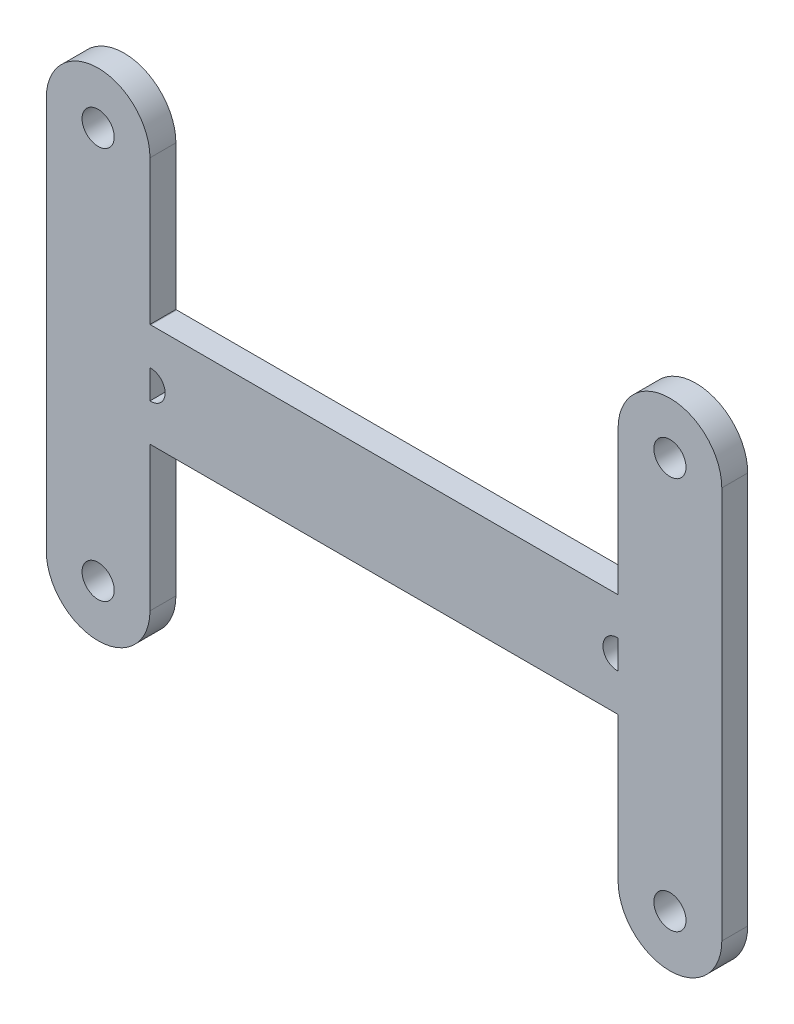
ISO-10303-21;
HEADER;
FILE_DESCRIPTION(('STEP AP214'),'2;1');
FILE_NAME('part.step','',(''),(''),'','','');
FILE_SCHEMA(('AUTOMOTIVE_DESIGN { 1 0 10303 214 1 1 1 1 }'));
ENDSEC;
DATA;
#1=APPLICATION_CONTEXT('core data for automotive mechanical design processes');
#2=APPLICATION_PROTOCOL_DEFINITION('international standard','automotive_design',2000,#1);
#3=PRODUCT_CONTEXT('',#1,'mechanical');
#4=PRODUCT('Part','Part','',(#3));
#5=PRODUCT_RELATED_PRODUCT_CATEGORY('part','',(#4));
#6=PRODUCT_DEFINITION_FORMATION('','',#4);
#7=PRODUCT_DEFINITION_CONTEXT('part definition',#1,'design');
#8=PRODUCT_DEFINITION('design','',#6,#7);
#9=PRODUCT_DEFINITION_SHAPE('','',#8);
#10=(LENGTH_UNIT() NAMED_UNIT(*) SI_UNIT(.MILLI.,.METRE.));
#11=(NAMED_UNIT(*) PLANE_ANGLE_UNIT() SI_UNIT($,.RADIAN.));
#12=(NAMED_UNIT(*) SI_UNIT($,.STERADIAN.) SOLID_ANGLE_UNIT());
#13=UNCERTAINTY_MEASURE_WITH_UNIT(LENGTH_MEASURE(1.E-05),#10,'distance_accuracy_value','');
#14=(GEOMETRIC_REPRESENTATION_CONTEXT(3) GLOBAL_UNCERTAINTY_ASSIGNED_CONTEXT((#13)) GLOBAL_UNIT_ASSIGNED_CONTEXT((#10,
#11,#12)) REPRESENTATION_CONTEXT('',''));
#15=CARTESIAN_POINT('',(0.,0.,0.));
#16=DIRECTION('',(0.,0.,1.));
#17=DIRECTION('',(1.,0.,0.));
#18=AXIS2_PLACEMENT_3D('',#15,#16,#17);
#19=CARTESIAN_POINT('',(-22.5771644662754,0.,2.5));
#20=DIRECTION('',(1.,0.,0.));
#21=DIRECTION('',(0.,0.,-1.));
#22=AXIS2_PLACEMENT_3D('',#19,#20,#21);
#23=PLANE('',#22);
#24=DIRECTION('',(0.,-1.,0.));
#25=VECTOR('',#24,1.);
#26=CARTESIAN_POINT('',(-22.5771644662754,0.,0.));
#27=LINE('',#26,#25);
#28=CARTESIAN_POINT('',(-22.5771644662754,1.38277254756162,0.));
#29=VERTEX_POINT('',#28);
#30=CARTESIAN_POINT('',(-22.5771644662754,-1.38277254756162,0.));
#31=VERTEX_POINT('',#30);
#32=EDGE_CURVE('E264',#29,#31,#27,.T.);
#33=ORIENTED_EDGE('',*,*,#32,.F.);
#34=DIRECTION('',(0.,0.,-1.));
#35=VECTOR('',#34,1.);
#36=CARTESIAN_POINT('',(-22.5771644662754,1.38277254756162,2.5));
#37=LINE('',#36,#35);
#38=CARTESIAN_POINT('',(-22.5771644662754,1.38277254756162,2.5));
#39=VERTEX_POINT('',#38);
#40=EDGE_CURVE('E11',#39,#29,#37,.T.);
#41=ORIENTED_EDGE('',*,*,#40,.F.);
#42=DIRECTION('',(0.,-1.,0.));
#43=VECTOR('',#42,1.);
#44=CARTESIAN_POINT('',(-22.5771644662754,0.,2.5));
#45=LINE('',#44,#43);
#46=CARTESIAN_POINT('',(-22.5771644662754,-1.38277254756162,2.5));
#47=VERTEX_POINT('',#46);
#48=EDGE_CURVE('E190',#39,#47,#45,.T.);
#49=ORIENTED_EDGE('',*,*,#48,.T.);
#50=DIRECTION('',(0.,0.,-1.));
#51=VECTOR('',#50,1.);
#52=CARTESIAN_POINT('',(-22.5771644662754,-1.38277254756162,2.5));
#53=LINE('',#52,#51);
#54=EDGE_CURVE('E51',#47,#31,#53,.T.);
#55=ORIENTED_EDGE('',*,*,#54,.T.);
#56=EDGE_LOOP('',(#33,#41,#49,#55));
#57=FACE_BOUND('',#56,.T.);
#58=ADVANCED_FACE('F41',(#57),#23,.T.);
#59=CARTESIAN_POINT('',(22.5,0.,2.5));
#60=DIRECTION('',(0.,0.,-1.));
#61=DIRECTION('',(-1.,0.,0.));
#62=AXIS2_PLACEMENT_3D('',#59,#60,#61);
#63=CYLINDRICAL_SURFACE('',#62,1.38492392323391);
#64=CARTESIAN_POINT('',(22.5,0.,0.));
#65=DIRECTION('',(0.,0.,1.));
#66=DIRECTION('',(1.,0.,0.));
#67=AXIS2_PLACEMENT_3D('',#64,#65,#66);
#68=CIRCLE('',#67,1.38492392323391);
#69=CARTESIAN_POINT('',(22.5771644662754,-1.38277254756162,0.));
#70=VERTEX_POINT('',#69);
#71=CARTESIAN_POINT('',(22.5771644662754,1.38277254756162,0.));
#72=VERTEX_POINT('',#71);
#73=EDGE_CURVE('E261',#70,#72,#68,.F.);
#74=ORIENTED_EDGE('',*,*,#73,.T.);
#75=DIRECTION('',(0.,0.,-1.));
#76=VECTOR('',#75,1.);
#77=CARTESIAN_POINT('',(22.5771644662754,1.38277254756162,2.5));
#78=LINE('',#77,#76);
#79=CARTESIAN_POINT('',(22.5771644662754,1.38277254756162,2.5));
#80=VERTEX_POINT('',#79);
#81=EDGE_CURVE('E199',#80,#72,#78,.T.);
#82=ORIENTED_EDGE('',*,*,#81,.F.);
#83=CARTESIAN_POINT('',(22.5,0.,2.5));
#84=DIRECTION('',(0.,0.,1.));
#85=DIRECTION('',(1.,0.,0.));
#86=AXIS2_PLACEMENT_3D('',#83,#84,#85);
#87=CIRCLE('',#86,1.38492392323391);
#88=CARTESIAN_POINT('',(22.5771644662754,-1.38277254756162,2.5));
#89=VERTEX_POINT('',#88);
#90=EDGE_CURVE('E186',#89,#80,#87,.F.);
#91=ORIENTED_EDGE('',*,*,#90,.F.);
#92=DIRECTION('',(0.,0.,-1.));
#93=VECTOR('',#92,1.);
#94=CARTESIAN_POINT('',(22.5771644662754,-1.38277254756162,2.5));
#95=LINE('',#94,#93);
#96=EDGE_CURVE('E193',#89,#70,#95,.T.);
#97=ORIENTED_EDGE('',*,*,#96,.T.);
#98=EDGE_LOOP('',(#74,#82,#91,#97));
#99=FACE_BOUND('',#98,.T.);
#100=ADVANCED_FACE('F201',(#99),#63,.F.);
#101=CARTESIAN_POINT('',(27.5771644662754,18.9226855296852,2.5));
#102=DIRECTION('',(0.,0.,-1.));
#103=DIRECTION('',(-1.,0.,0.));
#104=AXIS2_PLACEMENT_3D('',#101,#102,#103);
#105=CYLINDRICAL_SURFACE('',#104,5.);
#106=CARTESIAN_POINT('',(27.5771644662754,18.9226855296852,0.));
#107=DIRECTION('',(0.,0.,1.));
#108=DIRECTION('',(1.,0.,0.));
#109=AXIS2_PLACEMENT_3D('',#106,#107,#108);
#110=CIRCLE('',#109,5.);
#111=CARTESIAN_POINT('',(22.5771644662754,18.9226855296852,0.));
#112=VERTEX_POINT('',#111);
#113=CARTESIAN_POINT('',(32.5771644662754,18.9226855296852,0.));
#114=VERTEX_POINT('',#113);
#115=EDGE_CURVE('E225',#112,#114,#110,.F.);
#116=ORIENTED_EDGE('',*,*,#115,.F.);
#117=DIRECTION('',(0.,0.,-1.));
#118=VECTOR('',#117,1.);
#119=CARTESIAN_POINT('',(22.5771644662754,18.9226855296852,2.5));
#120=LINE('',#119,#118);
#121=CARTESIAN_POINT('',(22.5771644662754,18.9226855296852,2.5));
#122=VERTEX_POINT('',#121);
#123=EDGE_CURVE('E45',#122,#112,#120,.T.);
#124=ORIENTED_EDGE('',*,*,#123,.F.);
#125=CARTESIAN_POINT('',(27.5771644662754,18.9226855296852,2.5));
#126=DIRECTION('',(0.,0.,1.));
#127=DIRECTION('',(1.,0.,0.));
#128=AXIS2_PLACEMENT_3D('',#125,#126,#127);
#129=CIRCLE('',#128,5.);
#130=CARTESIAN_POINT('',(32.5771644662754,18.9226855296852,2.5));
#131=VERTEX_POINT('',#130);
#132=EDGE_CURVE('E281',#122,#131,#129,.F.);
#133=ORIENTED_EDGE('',*,*,#132,.T.);
#134=DIRECTION('',(0.,0.,-1.));
#135=VECTOR('',#134,1.);
#136=CARTESIAN_POINT('',(32.5771644662754,18.9226855296852,2.5));
#137=LINE('',#136,#135);
#138=EDGE_CURVE('E224',#131,#114,#137,.T.);
#139=ORIENTED_EDGE('',*,*,#138,.T.);
#140=EDGE_LOOP('',(#116,#124,#133,#139));
#141=FACE_BOUND('',#140,.T.);
#142=ADVANCED_FACE('F43',(#141),#105,.T.);
#143=CARTESIAN_POINT('',(22.5771644662754,0.,2.5));
#144=DIRECTION('',(1.,0.,0.));
#145=DIRECTION('',(0.,0.,-1.));
#146=AXIS2_PLACEMENT_3D('',#143,#144,#145);
#147=PLANE('',#146);
#148=DIRECTION('',(0.,-1.,0.));
#149=VECTOR('',#148,1.);
#150=CARTESIAN_POINT('',(22.5771644662754,0.,0.));
#151=LINE('',#150,#149);
#152=CARTESIAN_POINT('',(22.5771644662754,4.99940452905588,0.));
#153=VERTEX_POINT('',#152);
#154=EDGE_CURVE('E228',#112,#153,#151,.T.);
#155=ORIENTED_EDGE('',*,*,#154,.T.);
#156=DIRECTION('',(0.,0.,-1.));
#157=VECTOR('',#156,1.);
#158=CARTESIAN_POINT('',(22.5771644662754,4.99940452905588,2.5));
#159=LINE('',#158,#157);
#160=CARTESIAN_POINT('',(22.5771644662754,4.99940452905588,2.5));
#161=VERTEX_POINT('',#160);
#162=EDGE_CURVE('E315',#161,#153,#159,.T.);
#163=ORIENTED_EDGE('',*,*,#162,.F.);
#164=DIRECTION('',(0.,-1.,0.));
#165=VECTOR('',#164,1.);
#166=CARTESIAN_POINT('',(22.5771644662754,0.,2.5));
#167=LINE('',#166,#165);
#168=EDGE_CURVE('E324',#122,#161,#167,.T.);
#169=ORIENTED_EDGE('',*,*,#168,.F.);
#170=ORIENTED_EDGE('',*,*,#123,.T.);
#171=EDGE_LOOP('',(#155,#163,#169,#170));
#172=FACE_BOUND('',#171,.T.);
#173=ADVANCED_FACE('F323',(#172),#147,.F.);
#174=CARTESIAN_POINT('',(22.5,0.,2.5));
#175=DIRECTION('',(0.,0.,-1.));
#176=DIRECTION('',(-1.,0.,0.));
#177=AXIS2_PLACEMENT_3D('',#174,#175,#176);
#178=CYLINDRICAL_SURFACE('',#177,5.);
#179=CARTESIAN_POINT('',(22.5,0.,0.));
#180=DIRECTION('',(0.,0.,1.));
#181=DIRECTION('',(1.,0.,0.));
#182=AXIS2_PLACEMENT_3D('',#179,#180,#181);
#183=CIRCLE('',#182,5.);
#184=CARTESIAN_POINT('',(22.5,5.,0.));
#185=VERTEX_POINT('',#184);
#186=EDGE_CURVE('E230',#153,#185,#183,.T.);
#187=ORIENTED_EDGE('',*,*,#186,.T.);
#188=DIRECTION('',(0.,0.,-1.));
#189=VECTOR('',#188,1.);
#190=CARTESIAN_POINT('',(22.5,5.,2.5));
#191=LINE('',#190,#189);
#192=CARTESIAN_POINT('',(22.5,5.,2.5));
#193=VERTEX_POINT('',#192);
#194=EDGE_CURVE('E314',#193,#185,#191,.T.);
#195=ORIENTED_EDGE('',*,*,#194,.F.);
#196=CARTESIAN_POINT('',(22.5,0.,2.5));
#197=DIRECTION('',(0.,0.,1.));
#198=DIRECTION('',(1.,0.,0.));
#199=AXIS2_PLACEMENT_3D('',#196,#197,#198);
#200=CIRCLE('',#199,5.);
#201=EDGE_CURVE('E711',#161,#193,#200,.T.);
#202=ORIENTED_EDGE('',*,*,#201,.F.);
#203=ORIENTED_EDGE('',*,*,#162,.T.);
#204=EDGE_LOOP('',(#187,#195,#202,#203));
#205=FACE_BOUND('',#204,.T.);
#206=ADVANCED_FACE('F402',(#205),#178,.T.);
#207=CARTESIAN_POINT('',(0.,5.,2.5));
#208=DIRECTION('',(0.,1.,0.));
#209=DIRECTION('',(0.,0.,1.));
#210=AXIS2_PLACEMENT_3D('',#207,#208,#209);
#211=PLANE('',#210);
#212=DIRECTION('',(1.,0.,0.));
#213=VECTOR('',#212,1.);
#214=CARTESIAN_POINT('',(0.,5.,0.));
#215=LINE('',#214,#213);
#216=CARTESIAN_POINT('',(-22.5,5.,0.));
#217=VERTEX_POINT('',#216);
#218=EDGE_CURVE('E234',#217,#185,#215,.T.);
#219=ORIENTED_EDGE('',*,*,#218,.F.);
#220=DIRECTION('',(0.,0.,-1.));
#221=VECTOR('',#220,1.);
#222=CARTESIAN_POINT('',(-22.5,5.,2.5));
#223=LINE('',#222,#221);
#224=CARTESIAN_POINT('',(-22.5,5.,2.5));
#225=VERTEX_POINT('',#224);
#226=EDGE_CURVE('E312',#225,#217,#223,.T.);
#227=ORIENTED_EDGE('',*,*,#226,.F.);
#228=DIRECTION('',(1.,0.,0.));
#229=VECTOR('',#228,1.);
#230=CARTESIAN_POINT('',(0.,5.,2.5));
#231=LINE('',#230,#229);
#232=EDGE_CURVE('E401',#225,#193,#231,.T.);
#233=ORIENTED_EDGE('',*,*,#232,.T.);
#234=ORIENTED_EDGE('',*,*,#194,.T.);
#235=EDGE_LOOP('',(#219,#227,#233,#234));
#236=FACE_BOUND('',#235,.T.);
#237=ADVANCED_FACE('F397',(#236),#211,.T.);
#238=CARTESIAN_POINT('',(-22.5,0.,2.5));
#239=DIRECTION('',(0.,0.,-1.));
#240=DIRECTION('',(-1.,0.,0.));
#241=AXIS2_PLACEMENT_3D('',#238,#239,#240);
#242=CYLINDRICAL_SURFACE('',#241,5.);
#243=CARTESIAN_POINT('',(-22.5,0.,0.));
#244=DIRECTION('',(0.,0.,1.));
#245=DIRECTION('',(1.,0.,0.));
#246=AXIS2_PLACEMENT_3D('',#243,#244,#245);
#247=CIRCLE('',#246,5.);
#248=CARTESIAN_POINT('',(-22.5771644662754,4.99940452905588,0.));
#249=VERTEX_POINT('',#248);
#250=EDGE_CURVE('E238',#217,#249,#247,.T.);
#251=ORIENTED_EDGE('',*,*,#250,.T.);
#252=DIRECTION('',(0.,0.,-1.));
#253=VECTOR('',#252,1.);
#254=CARTESIAN_POINT('',(-22.5771644662754,4.99940452905588,2.5));
#255=LINE('',#254,#253);
#256=CARTESIAN_POINT('',(-22.5771644662754,4.99940452905588,2.5));
#257=VERTEX_POINT('',#256);
#258=EDGE_CURVE('E310',#257,#249,#255,.T.);
#259=ORIENTED_EDGE('',*,*,#258,.F.);
#260=CARTESIAN_POINT('',(-22.5,0.,2.5));
#261=DIRECTION('',(0.,0.,1.));
#262=DIRECTION('',(1.,0.,0.));
#263=AXIS2_PLACEMENT_3D('',#260,#261,#262);
#264=CIRCLE('',#263,5.);
#265=EDGE_CURVE('E718',#225,#257,#264,.T.);
#266=ORIENTED_EDGE('',*,*,#265,.F.);
#267=ORIENTED_EDGE('',*,*,#226,.T.);
#268=EDGE_LOOP('',(#251,#259,#266,#267));
#269=FACE_BOUND('',#268,.T.);
#270=ADVANCED_FACE('F394',(#269),#242,.T.);
#271=CARTESIAN_POINT('',(-22.5771644662754,0.,2.5));
#272=DIRECTION('',(1.,0.,0.));
#273=DIRECTION('',(0.,0.,-1.));
#274=AXIS2_PLACEMENT_3D('',#271,#272,#273);
#275=PLANE('',#274);
#276=DIRECTION('',(0.,-1.,0.));
#277=VECTOR('',#276,1.);
#278=CARTESIAN_POINT('',(-22.5771644662754,0.,0.));
#279=LINE('',#278,#277);
#280=CARTESIAN_POINT('',(-22.5771644662754,18.9226855296852,0.));
#281=VERTEX_POINT('',#280);
#282=EDGE_CURVE('E241',#281,#249,#279,.T.);
#283=ORIENTED_EDGE('',*,*,#282,.F.);
#284=DIRECTION('',(0.,0.,-1.));
#285=VECTOR('',#284,1.);
#286=CARTESIAN_POINT('',(-22.5771644662754,18.9226855296852,2.5));
#287=LINE('',#286,#285);
#288=CARTESIAN_POINT('',(-22.5771644662754,18.9226855296852,2.5));
#289=VERTEX_POINT('',#288);
#290=EDGE_CURVE('E308',#289,#281,#287,.T.);
#291=ORIENTED_EDGE('',*,*,#290,.F.);
#292=DIRECTION('',(0.,-1.,0.));
#293=VECTOR('',#292,1.);
#294=CARTESIAN_POINT('',(-22.5771644662754,0.,2.5));
#295=LINE('',#294,#293);
#296=EDGE_CURVE('E391',#289,#257,#295,.T.);
#297=ORIENTED_EDGE('',*,*,#296,.T.);
#298=ORIENTED_EDGE('',*,*,#258,.T.);
#299=EDGE_LOOP('',(#283,#291,#297,#298));
#300=FACE_BOUND('',#299,.T.);
#301=ADVANCED_FACE('F386',(#300),#275,.T.);
#302=CARTESIAN_POINT('',(-27.5771644662754,18.9226855296852,2.5));
#303=DIRECTION('',(0.,0.,-1.));
#304=DIRECTION('',(-1.,0.,0.));
#305=AXIS2_PLACEMENT_3D('',#302,#303,#304);
#306=CYLINDRICAL_SURFACE('',#305,5.);
#307=CARTESIAN_POINT('',(-27.5771644662754,18.9226855296852,0.));
#308=DIRECTION('',(0.,0.,1.));
#309=DIRECTION('',(1.,0.,0.));
#310=AXIS2_PLACEMENT_3D('',#307,#308,#309);
#311=CIRCLE('',#310,5.);
#312=CARTESIAN_POINT('',(-32.5771644662754,18.9226855296852,0.));
#313=VERTEX_POINT('',#312);
#314=EDGE_CURVE('E245',#281,#313,#311,.T.);
#315=ORIENTED_EDGE('',*,*,#314,.T.);
#316=DIRECTION('',(0.,0.,-1.));
#317=VECTOR('',#316,1.);
#318=CARTESIAN_POINT('',(-32.5771644662754,18.9226855296852,2.5));
#319=LINE('',#318,#317);
#320=CARTESIAN_POINT('',(-32.5771644662754,18.9226855296852,2.5));
#321=VERTEX_POINT('',#320);
#322=EDGE_CURVE('E305',#321,#313,#319,.T.);
#323=ORIENTED_EDGE('',*,*,#322,.F.);
#324=CARTESIAN_POINT('',(-27.5771644662754,18.9226855296852,2.5));
#325=DIRECTION('',(0.,0.,1.));
#326=DIRECTION('',(1.,0.,0.));
#327=AXIS2_PLACEMENT_3D('',#324,#325,#326);
#328=CIRCLE('',#327,5.);
#329=EDGE_CURVE('E721',#289,#321,#328,.T.);
#330=ORIENTED_EDGE('',*,*,#329,.F.);
#331=ORIENTED_EDGE('',*,*,#290,.T.);
#332=EDGE_LOOP('',(#315,#323,#330,#331));
#333=FACE_BOUND('',#332,.T.);
#334=ADVANCED_FACE('F629',(#333),#306,.T.);
#335=CARTESIAN_POINT('',(-32.5771644662754,0.,2.5));
#336=DIRECTION('',(1.,0.,0.));
#337=DIRECTION('',(0.,0.,-1.));
#338=AXIS2_PLACEMENT_3D('',#335,#336,#337);
#339=PLANE('',#338);
#340=DIRECTION('',(0.,-1.,0.));
#341=VECTOR('',#340,1.);
#342=CARTESIAN_POINT('',(-32.5771644662754,0.,0.));
#343=LINE('',#342,#341);
#344=CARTESIAN_POINT('',(-32.5771644662754,-18.9226855296852,0.));
#345=VERTEX_POINT('',#344);
#346=EDGE_CURVE('E248',#313,#345,#343,.T.);
#347=ORIENTED_EDGE('',*,*,#346,.T.);
#348=DIRECTION('',(0.,0.,-1.));
#349=VECTOR('',#348,1.);
#350=CARTESIAN_POINT('',(-32.5771644662754,-18.9226855296852,2.5));
#351=LINE('',#350,#349);
#352=CARTESIAN_POINT('',(-32.5771644662754,-18.9226855296852,2.5));
#353=VERTEX_POINT('',#352);
#354=EDGE_CURVE('E302',#353,#345,#351,.T.);
#355=ORIENTED_EDGE('',*,*,#354,.F.);
#356=DIRECTION('',(0.,-1.,0.));
#357=VECTOR('',#356,1.);
#358=CARTESIAN_POINT('',(-32.5771644662754,0.,2.5));
#359=LINE('',#358,#357);
#360=EDGE_CURVE('E379',#321,#353,#359,.T.);
#361=ORIENTED_EDGE('',*,*,#360,.F.);
#362=ORIENTED_EDGE('',*,*,#322,.T.);
#363=EDGE_LOOP('',(#347,#355,#361,#362));
#364=FACE_BOUND('',#363,.T.);
#365=ADVANCED_FACE('F378',(#364),#339,.F.);
#366=CARTESIAN_POINT('',(-27.5771644662754,-18.9226855296852,2.5));
#367=DIRECTION('',(0.,0.,-1.));
#368=DIRECTION('',(-1.,0.,0.));
#369=AXIS2_PLACEMENT_3D('',#366,#367,#368);
#370=CYLINDRICAL_SURFACE('',#369,5.);
#371=CARTESIAN_POINT('',(-27.5771644662754,-18.9226855296852,0.));
#372=DIRECTION('',(0.,0.,1.));
#373=DIRECTION('',(1.,0.,0.));
#374=AXIS2_PLACEMENT_3D('',#371,#372,#373);
#375=CIRCLE('',#374,5.);
#376=CARTESIAN_POINT('',(-22.5771644662754,-18.9226855296852,0.));
#377=VERTEX_POINT('',#376);
#378=EDGE_CURVE('E250',#345,#377,#375,.T.);
#379=ORIENTED_EDGE('',*,*,#378,.T.);
#380=DIRECTION('',(0.,0.,-1.));
#381=VECTOR('',#380,1.);
#382=CARTESIAN_POINT('',(-22.5771644662754,-18.9226855296852,2.5));
#383=LINE('',#382,#381);
#384=CARTESIAN_POINT('',(-22.5771644662754,-18.9226855296852,2.5));
#385=VERTEX_POINT('',#384);
#386=EDGE_CURVE('E300',#385,#377,#383,.T.);
#387=ORIENTED_EDGE('',*,*,#386,.F.);
#388=CARTESIAN_POINT('',(-27.5771644662754,-18.9226855296852,2.5));
#389=DIRECTION('',(0.,0.,1.));
#390=DIRECTION('',(1.,0.,0.));
#391=AXIS2_PLACEMENT_3D('',#388,#389,#390);
#392=CIRCLE('',#391,5.);
#393=EDGE_CURVE('E375',#353,#385,#392,.T.);
#394=ORIENTED_EDGE('',*,*,#393,.F.);
#395=ORIENTED_EDGE('',*,*,#354,.T.);
#396=EDGE_LOOP('',(#379,#387,#394,#395));
#397=FACE_BOUND('',#396,.T.);
#398=ADVANCED_FACE('F373',(#397),#370,.T.);
#399=CARTESIAN_POINT('',(-22.5771644662754,-4.99940452905588,0.));
#400=VERTEX_POINT('',#399);
#401=EDGE_CURVE('E246',#400,#377,#279,.T.);
#402=ORIENTED_EDGE('',*,*,#401,.F.);
#403=DIRECTION('',(0.,0.,-1.));
#404=VECTOR('',#403,1.);
#405=CARTESIAN_POINT('',(-22.5771644662754,-4.99940452905588,2.5));
#406=LINE('',#405,#404);
#407=CARTESIAN_POINT('',(-22.5771644662754,-4.99940452905588,2.5));
#408=VERTEX_POINT('',#407);
#409=EDGE_CURVE('E298',#408,#400,#406,.T.);
#410=ORIENTED_EDGE('',*,*,#409,.F.);
#411=EDGE_CURVE('E370',#408,#385,#295,.T.);
#412=ORIENTED_EDGE('',*,*,#411,.T.);
#413=ORIENTED_EDGE('',*,*,#386,.T.);
#414=EDGE_LOOP('',(#402,#410,#412,#413));
#415=FACE_BOUND('',#414,.T.);
#416=ADVANCED_FACE('F367',(#415),#275,.T.);
#417=CARTESIAN_POINT('',(-22.5,-5.,0.));
#418=VERTEX_POINT('',#417);
#419=EDGE_CURVE('E242',#400,#418,#247,.T.);
#420=ORIENTED_EDGE('',*,*,#419,.T.);
#421=DIRECTION('',(0.,0.,-1.));
#422=VECTOR('',#421,1.);
#423=CARTESIAN_POINT('',(-22.5,-5.,2.5));
#424=LINE('',#423,#422);
#425=CARTESIAN_POINT('',(-22.5,-5.,2.5));
#426=VERTEX_POINT('',#425);
#427=EDGE_CURVE('E295',#426,#418,#424,.T.);
#428=ORIENTED_EDGE('',*,*,#427,.F.);
#429=EDGE_CURVE('E362',#408,#426,#264,.T.);
#430=ORIENTED_EDGE('',*,*,#429,.F.);
#431=ORIENTED_EDGE('',*,*,#409,.T.);
#432=EDGE_LOOP('',(#420,#428,#430,#431));
#433=FACE_BOUND('',#432,.T.);
#434=ADVANCED_FACE('F361',(#433),#242,.T.);
#435=CARTESIAN_POINT('',(0.,-5.,2.5));
#436=DIRECTION('',(0.,1.,0.));
#437=DIRECTION('',(0.,0.,1.));
#438=AXIS2_PLACEMENT_3D('',#435,#436,#437);
#439=PLANE('',#438);
#440=DIRECTION('',(1.,0.,0.));
#441=VECTOR('',#440,1.);
#442=CARTESIAN_POINT('',(0.,-5.,0.));
#443=LINE('',#442,#441);
#444=CARTESIAN_POINT('',(22.5,-5.,0.));
#445=VERTEX_POINT('',#444);
#446=EDGE_CURVE('E253',#418,#445,#443,.T.);
#447=ORIENTED_EDGE('',*,*,#446,.T.);
#448=DIRECTION('',(0.,0.,-1.));
#449=VECTOR('',#448,1.);
#450=CARTESIAN_POINT('',(22.5,-5.,2.5));
#451=LINE('',#450,#449);
#452=CARTESIAN_POINT('',(22.5,-5.,2.5));
#453=VERTEX_POINT('',#452);
#454=EDGE_CURVE('E292',#453,#445,#451,.T.);
#455=ORIENTED_EDGE('',*,*,#454,.F.);
#456=DIRECTION('',(1.,0.,0.));
#457=VECTOR('',#456,1.);
#458=CARTESIAN_POINT('',(0.,-5.,2.5));
#459=LINE('',#458,#457);
#460=EDGE_CURVE('E358',#426,#453,#459,.T.);
#461=ORIENTED_EDGE('',*,*,#460,.F.);
#462=ORIENTED_EDGE('',*,*,#427,.T.);
#463=EDGE_LOOP('',(#447,#455,#461,#462));
#464=FACE_BOUND('',#463,.T.);
#465=ADVANCED_FACE('F355',(#464),#439,.F.);
#466=CARTESIAN_POINT('',(22.5771644662754,-4.99940452905588,0.));
#467=VERTEX_POINT('',#466);
#468=EDGE_CURVE('E235',#445,#467,#183,.T.);
#469=ORIENTED_EDGE('',*,*,#468,.T.);
#470=DIRECTION('',(0.,0.,-1.));
#471=VECTOR('',#470,1.);
#472=CARTESIAN_POINT('',(22.5771644662754,-4.99940452905588,2.5));
#473=LINE('',#472,#471);
#474=CARTESIAN_POINT('',(22.5771644662754,-4.99940452905588,2.5));
#475=VERTEX_POINT('',#474);
#476=EDGE_CURVE('E289',#475,#467,#473,.T.);
#477=ORIENTED_EDGE('',*,*,#476,.F.);
#478=EDGE_CURVE('E716',#453,#475,#200,.T.);
#479=ORIENTED_EDGE('',*,*,#478,.F.);
#480=ORIENTED_EDGE('',*,*,#454,.T.);
#481=EDGE_LOOP('',(#469,#477,#479,#480));
#482=FACE_BOUND('',#481,.T.);
#483=ADVANCED_FACE('F347',(#482),#178,.T.);
#484=CARTESIAN_POINT('',(22.5771644662754,-18.9226855296852,0.));
#485=VERTEX_POINT('',#484);
#486=EDGE_CURVE('E231',#467,#485,#151,.T.);
#487=ORIENTED_EDGE('',*,*,#486,.T.);
#488=DIRECTION('',(0.,0.,-1.));
#489=VECTOR('',#488,1.);
#490=CARTESIAN_POINT('',(22.5771644662754,-18.9226855296852,2.5));
#491=LINE('',#490,#489);
#492=CARTESIAN_POINT('',(22.5771644662754,-18.9226855296852,2.5));
#493=VERTEX_POINT('',#492);
#494=EDGE_CURVE('E287',#493,#485,#491,.T.);
#495=ORIENTED_EDGE('',*,*,#494,.F.);
#496=EDGE_CURVE('E713',#475,#493,#167,.T.);
#497=ORIENTED_EDGE('',*,*,#496,.F.);
#498=ORIENTED_EDGE('',*,*,#476,.T.);
#499=EDGE_LOOP('',(#487,#495,#497,#498));
#500=FACE_BOUND('',#499,.T.);
#501=ADVANCED_FACE('F344',(#500),#147,.F.);
#502=CARTESIAN_POINT('',(27.5771644662754,-18.9226855296852,2.5));
#503=DIRECTION('',(0.,0.,-1.));
#504=DIRECTION('',(-1.,0.,0.));
#505=AXIS2_PLACEMENT_3D('',#502,#503,#504);
#506=CYLINDRICAL_SURFACE('',#505,5.);
#507=CARTESIAN_POINT('',(27.5771644662754,-18.9226855296852,0.));
#508=DIRECTION('',(0.,0.,1.));
#509=DIRECTION('',(1.,0.,0.));
#510=AXIS2_PLACEMENT_3D('',#507,#508,#509);
#511=CIRCLE('',#510,5.);
#512=CARTESIAN_POINT('',(32.5771644662754,-18.9226855296852,0.));
#513=VERTEX_POINT('',#512);
#514=EDGE_CURVE('E255',#513,#485,#511,.F.);
#515=ORIENTED_EDGE('',*,*,#514,.F.);
#516=DIRECTION('',(0.,0.,-1.));
#517=VECTOR('',#516,1.);
#518=CARTESIAN_POINT('',(32.5771644662754,-18.9226855296852,2.5));
#519=LINE('',#518,#517);
#520=CARTESIAN_POINT('',(32.5771644662754,-18.9226855296852,2.5));
#521=VERTEX_POINT('',#520);
#522=EDGE_CURVE('E285',#521,#513,#519,.T.);
#523=ORIENTED_EDGE('',*,*,#522,.F.);
#524=CARTESIAN_POINT('',(27.5771644662754,-18.9226855296852,2.5));
#525=DIRECTION('',(0.,0.,1.));
#526=DIRECTION('',(1.,0.,0.));
#527=AXIS2_PLACEMENT_3D('',#524,#525,#526);
#528=CIRCLE('',#527,5.);
#529=EDGE_CURVE('E205',#521,#493,#528,.F.);
#530=ORIENTED_EDGE('',*,*,#529,.T.);
#531=ORIENTED_EDGE('',*,*,#494,.T.);
#532=EDGE_LOOP('',(#515,#523,#530,#531));
#533=FACE_BOUND('',#532,.T.);
#534=ADVANCED_FACE('F338',(#533),#506,.T.);
#535=CARTESIAN_POINT('',(27.5771644662753,-18.9226855296852,2.5));
#536=DIRECTION('',(0.,0.,-1.));
#537=DIRECTION('',(-1.,0.,0.));
#538=AXIS2_PLACEMENT_3D('',#535,#536,#537);
#539=CYLINDRICAL_SURFACE('',#538,1.55000000001874);
#540=CARTESIAN_POINT('',(27.5771644662753,-18.9226855296852,2.5));
#541=DIRECTION('',(0.,0.,1.));
#542=DIRECTION('',(1.,0.,0.));
#543=AXIS2_PLACEMENT_3D('',#540,#541,#542);
#544=CIRCLE('',#543,1.55000000001874);
#545=CARTESIAN_POINT('',(29.1271644662941,-18.9226855296852,2.5));
#546=VERTEX_POINT('',#545);
#547=EDGE_CURVE('E218',#546,#546,#544,.T.);
#548=ORIENTED_EDGE('',*,*,#547,.T.);
#549=EDGE_LOOP('',(#548));
#550=FACE_BOUND('',#549,.T.);
#551=CARTESIAN_POINT('',(27.5771644662753,-18.9226855296852,0.));
#552=DIRECTION('',(0.,0.,1.));
#553=DIRECTION('',(1.,0.,0.));
#554=AXIS2_PLACEMENT_3D('',#551,#552,#553);
#555=CIRCLE('',#554,1.55000000001874);
#556=CARTESIAN_POINT('',(29.1271644662941,-18.9226855296852,0.));
#557=VERTEX_POINT('',#556);
#558=EDGE_CURVE('E275',#557,#557,#555,.T.);
#559=ORIENTED_EDGE('',*,*,#558,.F.);
#560=EDGE_LOOP('',(#559));
#561=FACE_BOUND('',#560,.T.);
#562=ADVANCED_FACE('F428',(#550,#561),#539,.F.);
#563=CARTESIAN_POINT('',(-27.5771644662754,18.9226855296852,2.5));
#564=DIRECTION('',(0.,0.,-1.));
#565=DIRECTION('',(-1.,0.,0.));
#566=AXIS2_PLACEMENT_3D('',#563,#564,#565);
#567=CYLINDRICAL_SURFACE('',#566,1.55000000001874);
#568=CARTESIAN_POINT('',(-27.5771644662754,18.9226855296852,2.5));
#569=DIRECTION('',(0.,0.,1.));
#570=DIRECTION('',(1.,0.,0.));
#571=AXIS2_PLACEMENT_3D('',#568,#569,#570);
#572=CIRCLE('',#571,1.55000000001874);
#573=CARTESIAN_POINT('',(-26.0271644662566,18.9226855296852,2.5));
#574=VERTEX_POINT('',#573);
#575=EDGE_CURVE('E215',#574,#574,#572,.F.);
#576=ORIENTED_EDGE('',*,*,#575,.F.);
#577=EDGE_LOOP('',(#576));
#578=FACE_BOUND('',#577,.T.);
#579=CARTESIAN_POINT('',(-27.5771644662754,18.9226855296852,0.));
#580=DIRECTION('',(0.,0.,1.));
#581=DIRECTION('',(1.,0.,0.));
#582=AXIS2_PLACEMENT_3D('',#579,#580,#581);
#583=CIRCLE('',#582,1.55000000001874);
#584=CARTESIAN_POINT('',(-26.0271644662566,18.9226855296852,0.));
#585=VERTEX_POINT('',#584);
#586=EDGE_CURVE('E272',#585,#585,#583,.F.);
#587=ORIENTED_EDGE('',*,*,#586,.T.);
#588=EDGE_LOOP('',(#587));
#589=FACE_BOUND('',#588,.T.);
#590=ADVANCED_FACE('F445',(#578,#589),#567,.F.);
#591=CARTESIAN_POINT('',(-27.5771644662754,-18.9226855296852,2.5));
#592=DIRECTION('',(0.,0.,-1.));
#593=DIRECTION('',(-1.,0.,0.));
#594=AXIS2_PLACEMENT_3D('',#591,#592,#593);
#595=CYLINDRICAL_SURFACE('',#594,1.55000000001874);
#596=CARTESIAN_POINT('',(-27.5771644662754,-18.9226855296852,2.5));
#597=DIRECTION('',(0.,0.,1.));
#598=DIRECTION('',(1.,0.,0.));
#599=AXIS2_PLACEMENT_3D('',#596,#597,#598);
#600=CIRCLE('',#599,1.55000000001874);
#601=CARTESIAN_POINT('',(-26.0271644662566,-18.9226855296852,2.5));
#602=VERTEX_POINT('',#601);
#603=EDGE_CURVE('E212',#602,#602,#600,.T.);
#604=ORIENTED_EDGE('',*,*,#603,.T.);
#605=EDGE_LOOP('',(#604));
#606=FACE_BOUND('',#605,.T.);
#607=CARTESIAN_POINT('',(-27.5771644662754,-18.9226855296852,0.));
#608=DIRECTION('',(0.,0.,1.));
#609=DIRECTION('',(1.,0.,0.));
#610=AXIS2_PLACEMENT_3D('',#607,#608,#609);
#611=CIRCLE('',#610,1.55000000001874);
#612=CARTESIAN_POINT('',(-26.0271644662566,-18.9226855296852,0.));
#613=VERTEX_POINT('',#612);
#614=EDGE_CURVE('E269',#613,#613,#611,.T.);
#615=ORIENTED_EDGE('',*,*,#614,.F.);
#616=EDGE_LOOP('',(#615));
#617=FACE_BOUND('',#616,.T.);
#618=ADVANCED_FACE('F453',(#606,#617),#595,.F.);
#619=CARTESIAN_POINT('',(-22.5,0.,2.5));
#620=DIRECTION('',(0.,0.,-1.));
#621=DIRECTION('',(-1.,0.,0.));
#622=AXIS2_PLACEMENT_3D('',#619,#620,#621);
#623=CYLINDRICAL_SURFACE('',#622,1.38492392323391);
#624=CARTESIAN_POINT('',(-22.5,0.,0.));
#625=DIRECTION('',(0.,0.,1.));
#626=DIRECTION('',(1.,0.,0.));
#627=AXIS2_PLACEMENT_3D('',#624,#625,#626);
#628=CIRCLE('',#627,1.38492392323391);
#629=EDGE_CURVE('E266',#31,#29,#628,.T.);
#630=ORIENTED_EDGE('',*,*,#629,.F.);
#631=ORIENTED_EDGE('',*,*,#54,.F.);
#632=CARTESIAN_POINT('',(-22.5,0.,2.5));
#633=DIRECTION('',(0.,0.,1.));
#634=DIRECTION('',(1.,0.,0.));
#635=AXIS2_PLACEMENT_3D('',#632,#633,#634);
#636=CIRCLE('',#635,1.38492392323391);
#637=EDGE_CURVE('E210',#47,#39,#636,.T.);
#638=ORIENTED_EDGE('',*,*,#637,.T.);
#639=ORIENTED_EDGE('',*,*,#40,.T.);
#640=EDGE_LOOP('',(#630,#631,#638,#639));
#641=FACE_BOUND('',#640,.T.);
#642=ADVANCED_FACE('F420',(#641),#623,.F.);
#643=CARTESIAN_POINT('',(22.5771644662754,0.,2.5));
#644=DIRECTION('',(1.,0.,0.));
#645=DIRECTION('',(0.,0.,-1.));
#646=AXIS2_PLACEMENT_3D('',#643,#644,#645);
#647=PLANE('',#646);
#648=DIRECTION('',(0.,-1.,0.));
#649=VECTOR('',#648,1.);
#650=CARTESIAN_POINT('',(22.5771644662754,0.,0.));
#651=LINE('',#650,#649);
#652=EDGE_CURVE('E195',#72,#70,#651,.T.);
#653=ORIENTED_EDGE('',*,*,#652,.T.);
#654=ORIENTED_EDGE('',*,*,#96,.F.);
#655=DIRECTION('',(0.,-1.,0.));
#656=VECTOR('',#655,1.);
#657=CARTESIAN_POINT('',(22.5771644662754,0.,2.5));
#658=LINE('',#657,#656);
#659=EDGE_CURVE('E181',#80,#89,#658,.T.);
#660=ORIENTED_EDGE('',*,*,#659,.F.);
#661=ORIENTED_EDGE('',*,*,#81,.T.);
#662=EDGE_LOOP('',(#653,#654,#660,#661));
#663=FACE_BOUND('',#662,.T.);
#664=ADVANCED_FACE('F194',(#663),#647,.F.);
#665=CARTESIAN_POINT('',(32.5771644662754,0.,2.5));
#666=DIRECTION('',(1.,0.,0.));
#667=DIRECTION('',(0.,0.,-1.));
#668=AXIS2_PLACEMENT_3D('',#665,#666,#667);
#669=PLANE('',#668);
#670=DIRECTION('',(0.,-1.,0.));
#671=VECTOR('',#670,1.);
#672=CARTESIAN_POINT('',(32.5771644662754,0.,0.));
#673=LINE('',#672,#671);
#674=EDGE_CURVE('E258',#114,#513,#673,.T.);
#675=ORIENTED_EDGE('',*,*,#674,.F.);
#676=ORIENTED_EDGE('',*,*,#138,.F.);
#677=DIRECTION('',(0.,-1.,0.));
#678=VECTOR('',#677,1.);
#679=CARTESIAN_POINT('',(32.5771644662754,0.,2.5));
#680=LINE('',#679,#678);
#681=EDGE_CURVE('E202',#131,#521,#680,.T.);
#682=ORIENTED_EDGE('',*,*,#681,.T.);
#683=ORIENTED_EDGE('',*,*,#522,.T.);
#684=EDGE_LOOP('',(#675,#676,#682,#683));
#685=FACE_BOUND('',#684,.T.);
#686=ADVANCED_FACE('F332',(#685),#669,.T.);
#687=CARTESIAN_POINT('',(27.5771644662754,18.9226855296852,2.5));
#688=DIRECTION('',(0.,0.,-1.));
#689=DIRECTION('',(-1.,0.,0.));
#690=AXIS2_PLACEMENT_3D('',#687,#688,#689);
#691=CYLINDRICAL_SURFACE('',#690,1.55000000001874);
#692=CARTESIAN_POINT('',(27.5771644662754,18.9226855296852,2.5));
#693=DIRECTION('',(0.,0.,1.));
#694=DIRECTION('',(1.,0.,0.));
#695=AXIS2_PLACEMENT_3D('',#692,#693,#694);
#696=CIRCLE('',#695,1.55000000001874);
#697=CARTESIAN_POINT('',(29.1271644662941,18.9226855296852,2.5));
#698=VERTEX_POINT('',#697);
#699=EDGE_CURVE('E221',#698,#698,#696,.F.);
#700=ORIENTED_EDGE('',*,*,#699,.F.);
#701=EDGE_LOOP('',(#700));
#702=FACE_BOUND('',#701,.T.);
#703=CARTESIAN_POINT('',(27.5771644662754,18.9226855296852,0.));
#704=DIRECTION('',(0.,0.,1.));
#705=DIRECTION('',(1.,0.,0.));
#706=AXIS2_PLACEMENT_3D('',#703,#704,#705);
#707=CIRCLE('',#706,1.55000000001874);
#708=CARTESIAN_POINT('',(29.1271644662941,18.9226855296852,0.));
#709=VERTEX_POINT('',#708);
#710=EDGE_CURVE('E278',#709,#709,#707,.F.);
#711=ORIENTED_EDGE('',*,*,#710,.T.);
#712=EDGE_LOOP('',(#711));
#713=FACE_BOUND('',#712,.T.);
#714=ADVANCED_FACE('F426',(#702,#713),#691,.F.);
#715=CARTESIAN_POINT('',(0.,0.,2.5));
#716=DIRECTION('',(0.,0.,1.));
#717=DIRECTION('',(1.,0.,0.));
#718=AXIS2_PLACEMENT_3D('',#715,#716,#717);
#719=PLANE('',#718);
#720=ORIENTED_EDGE('',*,*,#132,.F.);
#721=ORIENTED_EDGE('',*,*,#168,.T.);
#722=ORIENTED_EDGE('',*,*,#201,.T.);
#723=ORIENTED_EDGE('',*,*,#232,.F.);
#724=ORIENTED_EDGE('',*,*,#265,.T.);
#725=ORIENTED_EDGE('',*,*,#296,.F.);
#726=ORIENTED_EDGE('',*,*,#329,.T.);
#727=ORIENTED_EDGE('',*,*,#360,.T.);
#728=ORIENTED_EDGE('',*,*,#393,.T.);
#729=ORIENTED_EDGE('',*,*,#411,.F.);
#730=ORIENTED_EDGE('',*,*,#429,.T.);
#731=ORIENTED_EDGE('',*,*,#460,.T.);
#732=ORIENTED_EDGE('',*,*,#478,.T.);
#733=ORIENTED_EDGE('',*,*,#496,.T.);
#734=ORIENTED_EDGE('',*,*,#529,.F.);
#735=ORIENTED_EDGE('',*,*,#681,.F.);
#736=EDGE_LOOP('',(#720,#721,#722,#723,#724,#725,#726,#727,#728,#729,#730,#731,#732,#733,#734,#735));
#737=FACE_BOUND('',#736,.T.);
#738=ORIENTED_EDGE('',*,*,#90,.T.);
#739=ORIENTED_EDGE('',*,*,#659,.T.);
#740=EDGE_LOOP('',(#738,#739));
#741=FACE_BOUND('',#740,.T.);
#742=ORIENTED_EDGE('',*,*,#48,.F.);
#743=ORIENTED_EDGE('',*,*,#637,.F.);
#744=EDGE_LOOP('',(#742,#743));
#745=FACE_BOUND('',#744,.T.);
#746=ORIENTED_EDGE('',*,*,#603,.F.);
#747=EDGE_LOOP('',(#746));
#748=FACE_BOUND('',#747,.T.);
#749=ORIENTED_EDGE('',*,*,#575,.T.);
#750=EDGE_LOOP('',(#749));
#751=FACE_BOUND('',#750,.T.);
#752=ORIENTED_EDGE('',*,*,#547,.F.);
#753=EDGE_LOOP('',(#752));
#754=FACE_BOUND('',#753,.T.);
#755=ORIENTED_EDGE('',*,*,#699,.T.);
#756=EDGE_LOOP('',(#755));
#757=FACE_BOUND('',#756,.T.);
#758=ADVANCED_FACE('F183',(#737,#741,#745,#748,#751,#754,#757),#719,.T.);
#759=CARTESIAN_POINT('',(0.,0.,0.));
#760=DIRECTION('',(0.,0.,1.));
#761=DIRECTION('',(1.,0.,0.));
#762=AXIS2_PLACEMENT_3D('',#759,#760,#761);
#763=PLANE('',#762);
#764=ORIENTED_EDGE('',*,*,#115,.T.);
#765=ORIENTED_EDGE('',*,*,#674,.T.);
#766=ORIENTED_EDGE('',*,*,#514,.T.);
#767=ORIENTED_EDGE('',*,*,#486,.F.);
#768=ORIENTED_EDGE('',*,*,#468,.F.);
#769=ORIENTED_EDGE('',*,*,#446,.F.);
#770=ORIENTED_EDGE('',*,*,#419,.F.);
#771=ORIENTED_EDGE('',*,*,#401,.T.);
#772=ORIENTED_EDGE('',*,*,#378,.F.);
#773=ORIENTED_EDGE('',*,*,#346,.F.);
#774=ORIENTED_EDGE('',*,*,#314,.F.);
#775=ORIENTED_EDGE('',*,*,#282,.T.);
#776=ORIENTED_EDGE('',*,*,#250,.F.);
#777=ORIENTED_EDGE('',*,*,#218,.T.);
#778=ORIENTED_EDGE('',*,*,#186,.F.);
#779=ORIENTED_EDGE('',*,*,#154,.F.);
#780=EDGE_LOOP('',(#764,#765,#766,#767,#768,#769,#770,#771,#772,#773,#774,#775,#776,#777,#778,#779));
#781=FACE_BOUND('',#780,.T.);
#782=ORIENTED_EDGE('',*,*,#73,.F.);
#783=ORIENTED_EDGE('',*,*,#652,.F.);
#784=EDGE_LOOP('',(#782,#783));
#785=FACE_BOUND('',#784,.T.);
#786=ORIENTED_EDGE('',*,*,#32,.T.);
#787=ORIENTED_EDGE('',*,*,#629,.T.);
#788=EDGE_LOOP('',(#786,#787));
#789=FACE_BOUND('',#788,.T.);
#790=ORIENTED_EDGE('',*,*,#614,.T.);
#791=EDGE_LOOP('',(#790));
#792=FACE_BOUND('',#791,.T.);
#793=ORIENTED_EDGE('',*,*,#586,.F.);
#794=EDGE_LOOP('',(#793));
#795=FACE_BOUND('',#794,.T.);
#796=ORIENTED_EDGE('',*,*,#558,.T.);
#797=EDGE_LOOP('',(#796));
#798=FACE_BOUND('',#797,.T.);
#799=ORIENTED_EDGE('',*,*,#710,.F.);
#800=EDGE_LOOP('',(#799));
#801=FACE_BOUND('',#800,.T.);
#802=ADVANCED_FACE('F327',(#781,#785,#789,#792,#795,#798,#801),#763,.F.);
#803=CLOSED_SHELL('',(#58,#100,#142,#173,#206,#237,#270,#301,#334,#365,#398,#416,#434,#465,#483,
#501,#534,#562,#590,#618,#642,#664,#686,#714,#758,#802));
#804=MANIFOLD_SOLID_BREP('B2',#803);
#805=ADVANCED_BREP_SHAPE_REPRESENTATION('',(#18,#804),#14);
#806=SHAPE_DEFINITION_REPRESENTATION(#9,#805);
ENDSEC;
END-ISO-10303-21;
